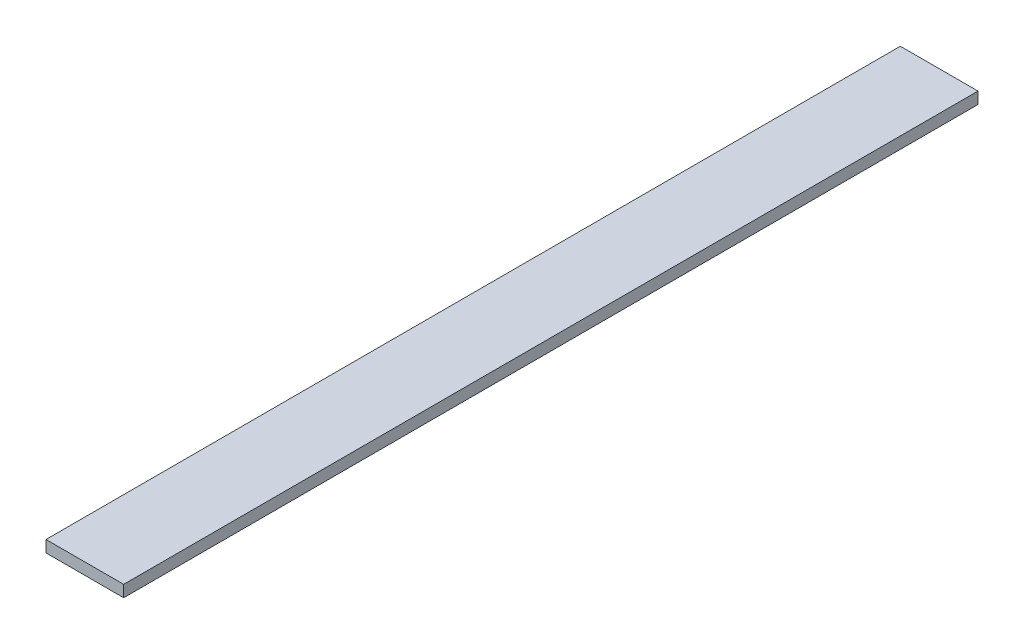
ISO-10303-21;
HEADER;
FILE_DESCRIPTION(('STEP AP214'),'2;1');
FILE_NAME('part.step','',(''),(''),'','','');
FILE_SCHEMA(('AUTOMOTIVE_DESIGN { 1 0 10303 214 1 1 1 1 }'));
ENDSEC;
DATA;
#1=APPLICATION_CONTEXT('core data for automotive mechanical design processes');
#2=APPLICATION_PROTOCOL_DEFINITION('international standard','automotive_design',2000,#1);
#3=PRODUCT_CONTEXT('',#1,'mechanical');
#4=PRODUCT('Part','Part','',(#3));
#5=PRODUCT_RELATED_PRODUCT_CATEGORY('part','',(#4));
#6=PRODUCT_DEFINITION_FORMATION('','',#4);
#7=PRODUCT_DEFINITION_CONTEXT('part definition',#1,'design');
#8=PRODUCT_DEFINITION('design','',#6,#7);
#9=PRODUCT_DEFINITION_SHAPE('','',#8);
#10=(LENGTH_UNIT() NAMED_UNIT(*) SI_UNIT(.MILLI.,.METRE.));
#11=(NAMED_UNIT(*) PLANE_ANGLE_UNIT() SI_UNIT($,.RADIAN.));
#12=(NAMED_UNIT(*) SI_UNIT($,.STERADIAN.) SOLID_ANGLE_UNIT());
#13=UNCERTAINTY_MEASURE_WITH_UNIT(LENGTH_MEASURE(1.E-05),#10,'distance_accuracy_value','');
#14=(GEOMETRIC_REPRESENTATION_CONTEXT(3) GLOBAL_UNCERTAINTY_ASSIGNED_CONTEXT((#13)) GLOBAL_UNIT_ASSIGNED_CONTEXT((#10,
#11,#12)) REPRESENTATION_CONTEXT('',''));
#15=CARTESIAN_POINT('',(0.,0.,0.));
#16=DIRECTION('',(0.,0.,1.));
#17=DIRECTION('',(1.,0.,0.));
#18=AXIS2_PLACEMENT_3D('',#15,#16,#17);
#19=CARTESIAN_POINT('',(-10.,3.,110.));
#20=DIRECTION('',(1.,0.,0.));
#21=DIRECTION('',(0.,0.,1.));
#22=AXIS2_PLACEMENT_3D('',#19,#20,#21);
#23=PLANE('',#22);
#24=DIRECTION('',(0.,1.,0.));
#25=VECTOR('',#24,1.);
#26=CARTESIAN_POINT('',(-10.,3.,-110.));
#27=LINE('',#26,#25);
#28=CARTESIAN_POINT('',(-10.,0.,-110.));
#29=VERTEX_POINT('',#28);
#30=CARTESIAN_POINT('',(-10.,3.,-110.));
#31=VERTEX_POINT('',#30);
#32=EDGE_CURVE('E11',#29,#31,#27,.T.);
#33=ORIENTED_EDGE('',*,*,#32,.F.);
#34=DIRECTION('',(0.,0.,-1.));
#35=VECTOR('',#34,1.);
#36=CARTESIAN_POINT('',(-10.,0.,0.));
#37=LINE('',#36,#35);
#38=CARTESIAN_POINT('',(-10.,0.,110.));
#39=VERTEX_POINT('',#38);
#40=EDGE_CURVE('E102',#29,#39,#37,.F.);
#41=ORIENTED_EDGE('',*,*,#40,.T.);
#42=DIRECTION('',(0.,1.,0.));
#43=VECTOR('',#42,1.);
#44=CARTESIAN_POINT('',(-10.,3.,110.));
#45=LINE('',#44,#43);
#46=CARTESIAN_POINT('',(-10.,3.,110.));
#47=VERTEX_POINT('',#46);
#48=EDGE_CURVE('E57',#39,#47,#45,.T.);
#49=ORIENTED_EDGE('',*,*,#48,.T.);
#50=DIRECTION('',(0.,0.,1.));
#51=VECTOR('',#50,1.);
#52=CARTESIAN_POINT('',(-10.,3.,110.));
#53=LINE('',#52,#51);
#54=EDGE_CURVE('E123',#31,#47,#53,.T.);
#55=ORIENTED_EDGE('',*,*,#54,.F.);
#56=EDGE_LOOP('',(#33,#41,#49,#55));
#57=FACE_BOUND('',#56,.T.);
#58=ADVANCED_FACE('F46',(#57),#23,.F.);
#59=CARTESIAN_POINT('',(-10.,3.,110.));
#60=DIRECTION('',(0.,0.,-1.));
#61=DIRECTION('',(1.,0.,0.));
#62=AXIS2_PLACEMENT_3D('',#59,#60,#61);
#63=PLANE('',#62);
#64=ORIENTED_EDGE('',*,*,#48,.F.);
#65=DIRECTION('',(1.,0.,0.));
#66=VECTOR('',#65,1.);
#67=CARTESIAN_POINT('',(0.,0.,110.));
#68=LINE('',#67,#66);
#69=CARTESIAN_POINT('',(10.,0.,110.));
#70=VERTEX_POINT('',#69);
#71=EDGE_CURVE('E112',#39,#70,#68,.T.);
#72=ORIENTED_EDGE('',*,*,#71,.T.);
#73=DIRECTION('',(0.,1.,0.));
#74=VECTOR('',#73,1.);
#75=CARTESIAN_POINT('',(10.,3.,110.));
#76=LINE('',#75,#74);
#77=CARTESIAN_POINT('',(10.,3.,110.));
#78=VERTEX_POINT('',#77);
#79=EDGE_CURVE('E65',#70,#78,#76,.T.);
#80=ORIENTED_EDGE('',*,*,#79,.T.);
#81=DIRECTION('',(1.,0.,0.));
#82=VECTOR('',#81,1.);
#83=CARTESIAN_POINT('',(-10.,3.,110.));
#84=LINE('',#83,#82);
#85=EDGE_CURVE('E96',#47,#78,#84,.T.);
#86=ORIENTED_EDGE('',*,*,#85,.F.);
#87=EDGE_LOOP('',(#64,#72,#80,#86));
#88=FACE_BOUND('',#87,.T.);
#89=ADVANCED_FACE('F128',(#88),#63,.F.);
#90=CARTESIAN_POINT('',(10.,3.,110.));
#91=DIRECTION('',(-1.,0.,0.));
#92=DIRECTION('',(0.,0.,-1.));
#93=AXIS2_PLACEMENT_3D('',#90,#91,#92);
#94=PLANE('',#93);
#95=ORIENTED_EDGE('',*,*,#79,.F.);
#96=DIRECTION('',(0.,0.,-1.));
#97=VECTOR('',#96,1.);
#98=CARTESIAN_POINT('',(10.,0.,0.));
#99=LINE('',#98,#97);
#100=CARTESIAN_POINT('',(10.,0.,-110.));
#101=VERTEX_POINT('',#100);
#102=EDGE_CURVE('E101',#70,#101,#99,.T.);
#103=ORIENTED_EDGE('',*,*,#102,.T.);
#104=DIRECTION('',(0.,1.,0.));
#105=VECTOR('',#104,1.);
#106=CARTESIAN_POINT('',(10.,3.,-110.));
#107=LINE('',#106,#105);
#108=CARTESIAN_POINT('',(10.,3.,-110.));
#109=VERTEX_POINT('',#108);
#110=EDGE_CURVE('E50',#101,#109,#107,.T.);
#111=ORIENTED_EDGE('',*,*,#110,.T.);
#112=DIRECTION('',(0.,0.,-1.));
#113=VECTOR('',#112,1.);
#114=CARTESIAN_POINT('',(10.,3.,110.));
#115=LINE('',#114,#113);
#116=EDGE_CURVE('E115',#78,#109,#115,.T.);
#117=ORIENTED_EDGE('',*,*,#116,.F.);
#118=EDGE_LOOP('',(#95,#103,#111,#117));
#119=FACE_BOUND('',#118,.T.);
#120=ADVANCED_FACE('F105',(#119),#94,.F.);
#121=CARTESIAN_POINT('',(-10.,3.,-110.));
#122=DIRECTION('',(0.,0.,1.));
#123=DIRECTION('',(-1.,0.,0.));
#124=AXIS2_PLACEMENT_3D('',#121,#122,#123);
#125=PLANE('',#124);
#126=DIRECTION('',(1.,0.,0.));
#127=VECTOR('',#126,1.);
#128=CARTESIAN_POINT('',(0.,0.,-110.));
#129=LINE('',#128,#127);
#130=EDGE_CURVE('E89',#101,#29,#129,.F.);
#131=ORIENTED_EDGE('',*,*,#130,.T.);
#132=ORIENTED_EDGE('',*,*,#32,.T.);
#133=DIRECTION('',(-1.,0.,0.));
#134=VECTOR('',#133,1.);
#135=CARTESIAN_POINT('',(-10.,3.,-110.));
#136=LINE('',#135,#134);
#137=EDGE_CURVE('E91',#109,#31,#136,.T.);
#138=ORIENTED_EDGE('',*,*,#137,.F.);
#139=ORIENTED_EDGE('',*,*,#110,.F.);
#140=EDGE_LOOP('',(#131,#132,#138,#139));
#141=FACE_BOUND('',#140,.T.);
#142=ADVANCED_FACE('F48',(#141),#125,.F.);
#143=CARTESIAN_POINT('',(0.,3.,0.));
#144=DIRECTION('',(0.,-1.,0.));
#145=DIRECTION('',(0.,0.,-1.));
#146=AXIS2_PLACEMENT_3D('',#143,#144,#145);
#147=PLANE('',#146);
#148=ORIENTED_EDGE('',*,*,#116,.T.);
#149=ORIENTED_EDGE('',*,*,#137,.T.);
#150=ORIENTED_EDGE('',*,*,#54,.T.);
#151=ORIENTED_EDGE('',*,*,#85,.T.);
#152=EDGE_LOOP('',(#148,#149,#150,#151));
#153=FACE_BOUND('',#152,.T.);
#154=ADVANCED_FACE('F126',(#153),#147,.F.);
#155=CARTESIAN_POINT('',(0.,0.,0.));
#156=DIRECTION('',(0.,-1.,0.));
#157=DIRECTION('',(0.,0.,-1.));
#158=AXIS2_PLACEMENT_3D('',#155,#156,#157);
#159=PLANE('',#158);
#160=ORIENTED_EDGE('',*,*,#102,.F.);
#161=ORIENTED_EDGE('',*,*,#71,.F.);
#162=ORIENTED_EDGE('',*,*,#40,.F.);
#163=ORIENTED_EDGE('',*,*,#130,.F.);
#164=EDGE_LOOP('',(#160,#161,#162,#163));
#165=FACE_BOUND('',#164,.T.);
#166=ADVANCED_FACE('F99',(#165),#159,.T.);
#167=CLOSED_SHELL('',(#58,#89,#120,#142,#154,#166));
#168=MANIFOLD_SOLID_BREP('B2',#167);
#169=ADVANCED_BREP_SHAPE_REPRESENTATION('',(#18,#168),#14);
#170=SHAPE_DEFINITION_REPRESENTATION(#9,#169);
ENDSEC;
END-ISO-10303-21;
